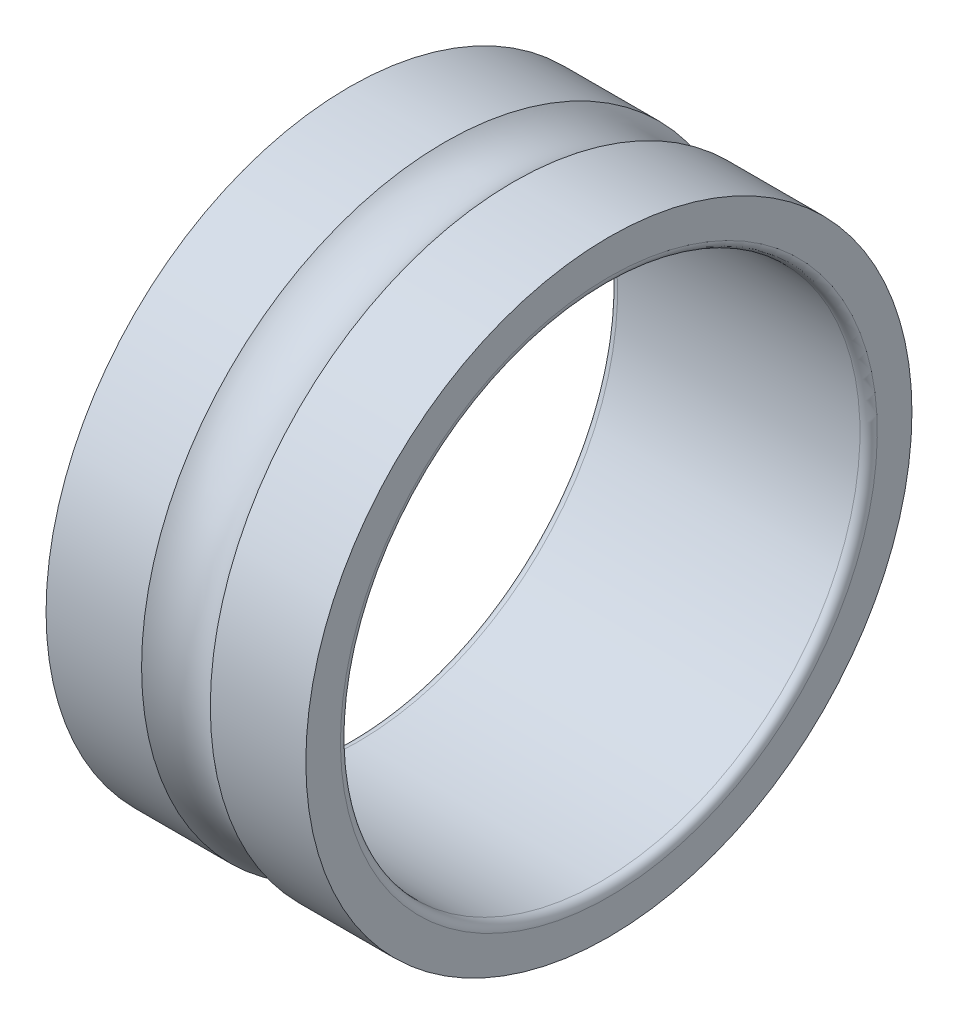
ISO-10303-21;
HEADER;
FILE_DESCRIPTION(('STEP AP214'),'2;1');
FILE_NAME('part.step','',(''),(''),'','','');
FILE_SCHEMA(('AUTOMOTIVE_DESIGN { 1 0 10303 214 1 1 1 1 }'));
ENDSEC;
DATA;
#1=APPLICATION_CONTEXT('core data for automotive mechanical design processes');
#2=APPLICATION_PROTOCOL_DEFINITION('international standard','automotive_design',2000,#1);
#3=PRODUCT_CONTEXT('',#1,'mechanical');
#4=PRODUCT('Part','Part','',(#3));
#5=PRODUCT_RELATED_PRODUCT_CATEGORY('part','',(#4));
#6=PRODUCT_DEFINITION_FORMATION('','',#4);
#7=PRODUCT_DEFINITION_CONTEXT('part definition',#1,'design');
#8=PRODUCT_DEFINITION('design','',#6,#7);
#9=PRODUCT_DEFINITION_SHAPE('','',#8);
#10=(LENGTH_UNIT() NAMED_UNIT(*) SI_UNIT(.MILLI.,.METRE.));
#11=(NAMED_UNIT(*) PLANE_ANGLE_UNIT() SI_UNIT($,.RADIAN.));
#12=(NAMED_UNIT(*) SI_UNIT($,.STERADIAN.) SOLID_ANGLE_UNIT());
#13=UNCERTAINTY_MEASURE_WITH_UNIT(LENGTH_MEASURE(1.E-05),#10,'distance_accuracy_value','');
#14=(GEOMETRIC_REPRESENTATION_CONTEXT(3) GLOBAL_UNCERTAINTY_ASSIGNED_CONTEXT((#13)) GLOBAL_UNIT_ASSIGNED_CONTEXT((#10,
#11,#12)) REPRESENTATION_CONTEXT('',''));
#15=CARTESIAN_POINT('',(0.,0.,0.));
#16=DIRECTION('',(0.,0.,1.));
#17=DIRECTION('',(1.,0.,0.));
#18=AXIS2_PLACEMENT_3D('',#15,#16,#17);
#19=CARTESIAN_POINT('',(2.44843134832985,0.,0.));
#20=DIRECTION('',(-1.,0.,0.));
#21=DIRECTION('',(0.,1.,0.));
#22=AXIS2_PLACEMENT_3D('',#19,#20,#21);
#23=CYLINDRICAL_SURFACE('',#22,3.5);
#24=CARTESIAN_POINT('',(1.89686269665969,0.,0.));
#25=DIRECTION('',(1.,0.,0.));
#26=DIRECTION('',(0.,1.,0.));
#27=AXIS2_PLACEMENT_3D('',#24,#25,#26);
#28=CIRCLE('',#27,3.5);
#29=CARTESIAN_POINT('',(1.89686269665969,3.5,0.));
#30=VERTEX_POINT('',#29);
#31=EDGE_CURVE('E11',#30,#30,#28,.T.);
#32=ORIENTED_EDGE('',*,*,#31,.T.);
#33=EDGE_LOOP('',(#32));
#34=FACE_BOUND('',#33,.T.);
#35=CARTESIAN_POINT('',(3.,0.,0.));
#36=DIRECTION('',(1.,0.,0.));
#37=DIRECTION('',(0.,1.,0.));
#38=AXIS2_PLACEMENT_3D('',#35,#36,#37);
#39=CIRCLE('',#38,3.5);
#40=CARTESIAN_POINT('',(3.,3.5,0.));
#41=VERTEX_POINT('',#40);
#42=EDGE_CURVE('E58',#41,#41,#39,.T.);
#43=ORIENTED_EDGE('',*,*,#42,.F.);
#44=EDGE_LOOP('',(#43));
#45=FACE_BOUND('',#44,.T.);
#46=ADVANCED_FACE('F16',(#34,#45),#23,.T.);
#47=CARTESIAN_POINT('',(1.5,0.,0.));
#48=DIRECTION('',(1.,0.,0.));
#49=DIRECTION('',(0.,0.,-1.));
#50=AXIS2_PLACEMENT_3D('',#47,#48,#49);
#51=TOROIDAL_SURFACE('',#50,3.95,0.6);
#52=CARTESIAN_POINT('',(1.10313730334031,0.,0.));
#53=DIRECTION('',(1.,0.,0.));
#54=DIRECTION('',(0.,1.,0.));
#55=AXIS2_PLACEMENT_3D('',#52,#53,#54);
#56=CIRCLE('',#55,3.5);
#57=CARTESIAN_POINT('',(1.10313730334031,3.5,0.));
#58=VERTEX_POINT('',#57);
#59=EDGE_CURVE('E25',#58,#58,#56,.T.);
#60=ORIENTED_EDGE('',*,*,#59,.T.);
#61=EDGE_LOOP('',(#60));
#62=FACE_BOUND('',#61,.T.);
#63=ORIENTED_EDGE('',*,*,#31,.F.);
#64=EDGE_LOOP('',(#63));
#65=FACE_BOUND('',#64,.T.);
#66=ADVANCED_FACE('F71',(#62,#65),#51,.F.);
#67=CARTESIAN_POINT('',(0.551568651670155,0.,0.));
#68=DIRECTION('',(-1.,0.,0.));
#69=DIRECTION('',(0.,1.,0.));
#70=AXIS2_PLACEMENT_3D('',#67,#68,#69);
#71=CYLINDRICAL_SURFACE('',#70,3.5);
#72=CARTESIAN_POINT('',(0.,0.,0.));
#73=DIRECTION('',(1.,0.,0.));
#74=DIRECTION('',(0.,1.,0.));
#75=AXIS2_PLACEMENT_3D('',#72,#73,#74);
#76=CIRCLE('',#75,3.5);
#77=CARTESIAN_POINT('',(0.,3.5,0.));
#78=VERTEX_POINT('',#77);
#79=EDGE_CURVE('E65',#78,#78,#76,.T.);
#80=ORIENTED_EDGE('',*,*,#79,.T.);
#81=EDGE_LOOP('',(#80));
#82=FACE_BOUND('',#81,.T.);
#83=ORIENTED_EDGE('',*,*,#59,.F.);
#84=EDGE_LOOP('',(#83));
#85=FACE_BOUND('',#84,.T.);
#86=ADVANCED_FACE('F74',(#82,#85),#71,.T.);
#87=CARTESIAN_POINT('',(0.,3.3,0.));
#88=DIRECTION('',(-1.,0.,0.));
#89=DIRECTION('',(0.,-1.,0.));
#90=AXIS2_PLACEMENT_3D('',#87,#88,#89);
#91=PLANE('',#90);
#92=CARTESIAN_POINT('',(0.,0.,0.));
#93=DIRECTION('',(1.,0.,0.));
#94=DIRECTION('',(0.,1.,0.));
#95=AXIS2_PLACEMENT_3D('',#92,#93,#94);
#96=CIRCLE('',#95,3.1);
#97=CARTESIAN_POINT('',(0.,3.1,0.));
#98=VERTEX_POINT('',#97);
#99=EDGE_CURVE('E46',#98,#98,#96,.T.);
#100=ORIENTED_EDGE('',*,*,#99,.T.);
#101=EDGE_LOOP('',(#100));
#102=FACE_BOUND('',#101,.T.);
#103=ORIENTED_EDGE('',*,*,#79,.F.);
#104=EDGE_LOOP('',(#103));
#105=FACE_BOUND('',#104,.T.);
#106=ADVANCED_FACE('F76',(#102,#105),#91,.T.);
#107=CARTESIAN_POINT('',(0.1,0.,0.));
#108=DIRECTION('',(1.,0.,0.));
#109=DIRECTION('',(0.,0.,-1.));
#110=AXIS2_PLACEMENT_3D('',#107,#108,#109);
#111=TOROIDAL_SURFACE('',#110,3.1,0.1);
#112=CARTESIAN_POINT('',(0.1,0.,0.));
#113=DIRECTION('',(1.,0.,0.));
#114=DIRECTION('',(0.,1.,0.));
#115=AXIS2_PLACEMENT_3D('',#112,#113,#114);
#116=CIRCLE('',#115,3.);
#117=CARTESIAN_POINT('',(0.1,3.,0.));
#118=VERTEX_POINT('',#117);
#119=EDGE_CURVE('E50',#118,#118,#116,.T.);
#120=ORIENTED_EDGE('',*,*,#119,.T.);
#121=EDGE_LOOP('',(#120));
#122=FACE_BOUND('',#121,.T.);
#123=ORIENTED_EDGE('',*,*,#99,.F.);
#124=EDGE_LOOP('',(#123));
#125=FACE_BOUND('',#124,.T.);
#126=ADVANCED_FACE('F83',(#122,#125),#111,.T.);
#127=CARTESIAN_POINT('',(1.5,0.,0.));
#128=DIRECTION('',(-1.,0.,0.));
#129=DIRECTION('',(0.,1.,0.));
#130=AXIS2_PLACEMENT_3D('',#127,#128,#129);
#131=CYLINDRICAL_SURFACE('',#130,3.);
#132=CARTESIAN_POINT('',(2.9,0.,0.));
#133=DIRECTION('',(1.,0.,0.));
#134=DIRECTION('',(0.,1.,0.));
#135=AXIS2_PLACEMENT_3D('',#132,#133,#134);
#136=CIRCLE('',#135,3.);
#137=CARTESIAN_POINT('',(2.9,3.,0.));
#138=VERTEX_POINT('',#137);
#139=EDGE_CURVE('E54',#138,#138,#136,.T.);
#140=ORIENTED_EDGE('',*,*,#139,.T.);
#141=EDGE_LOOP('',(#140));
#142=FACE_BOUND('',#141,.T.);
#143=ORIENTED_EDGE('',*,*,#119,.F.);
#144=EDGE_LOOP('',(#143));
#145=FACE_BOUND('',#144,.T.);
#146=ADVANCED_FACE('F55',(#142,#145),#131,.F.);
#147=CARTESIAN_POINT('',(2.9,0.,0.));
#148=DIRECTION('',(1.,0.,0.));
#149=DIRECTION('',(0.,0.,-1.));
#150=AXIS2_PLACEMENT_3D('',#147,#148,#149);
#151=TOROIDAL_SURFACE('',#150,3.1,0.1);
#152=CARTESIAN_POINT('',(3.,0.,0.));
#153=DIRECTION('',(1.,0.,0.));
#154=DIRECTION('',(0.,1.,0.));
#155=AXIS2_PLACEMENT_3D('',#152,#153,#154);
#156=CIRCLE('',#155,3.1);
#157=CARTESIAN_POINT('',(3.,3.1,0.));
#158=VERTEX_POINT('',#157);
#159=EDGE_CURVE('E61',#158,#158,#156,.T.);
#160=ORIENTED_EDGE('',*,*,#159,.T.);
#161=EDGE_LOOP('',(#160));
#162=FACE_BOUND('',#161,.T.);
#163=ORIENTED_EDGE('',*,*,#139,.F.);
#164=EDGE_LOOP('',(#163));
#165=FACE_BOUND('',#164,.T.);
#166=ADVANCED_FACE('F95',(#162,#165),#151,.T.);
#167=CARTESIAN_POINT('',(3.,3.3,0.));
#168=DIRECTION('',(1.,0.,0.));
#169=DIRECTION('',(0.,1.,0.));
#170=AXIS2_PLACEMENT_3D('',#167,#168,#169);
#171=PLANE('',#170);
#172=ORIENTED_EDGE('',*,*,#42,.T.);
#173=EDGE_LOOP('',(#172));
#174=FACE_BOUND('',#173,.T.);
#175=ORIENTED_EDGE('',*,*,#159,.F.);
#176=EDGE_LOOP('',(#175));
#177=FACE_BOUND('',#176,.T.);
#178=ADVANCED_FACE('F18',(#174,#177),#171,.T.);
#179=CLOSED_SHELL('',(#46,#66,#86,#106,#126,#146,#166,#178));
#180=MANIFOLD_SOLID_BREP('B1',#179);
#181=ADVANCED_BREP_SHAPE_REPRESENTATION('',(#18,#180),#14);
#182=SHAPE_DEFINITION_REPRESENTATION(#9,#181);
ENDSEC;
END-ISO-10303-21;
